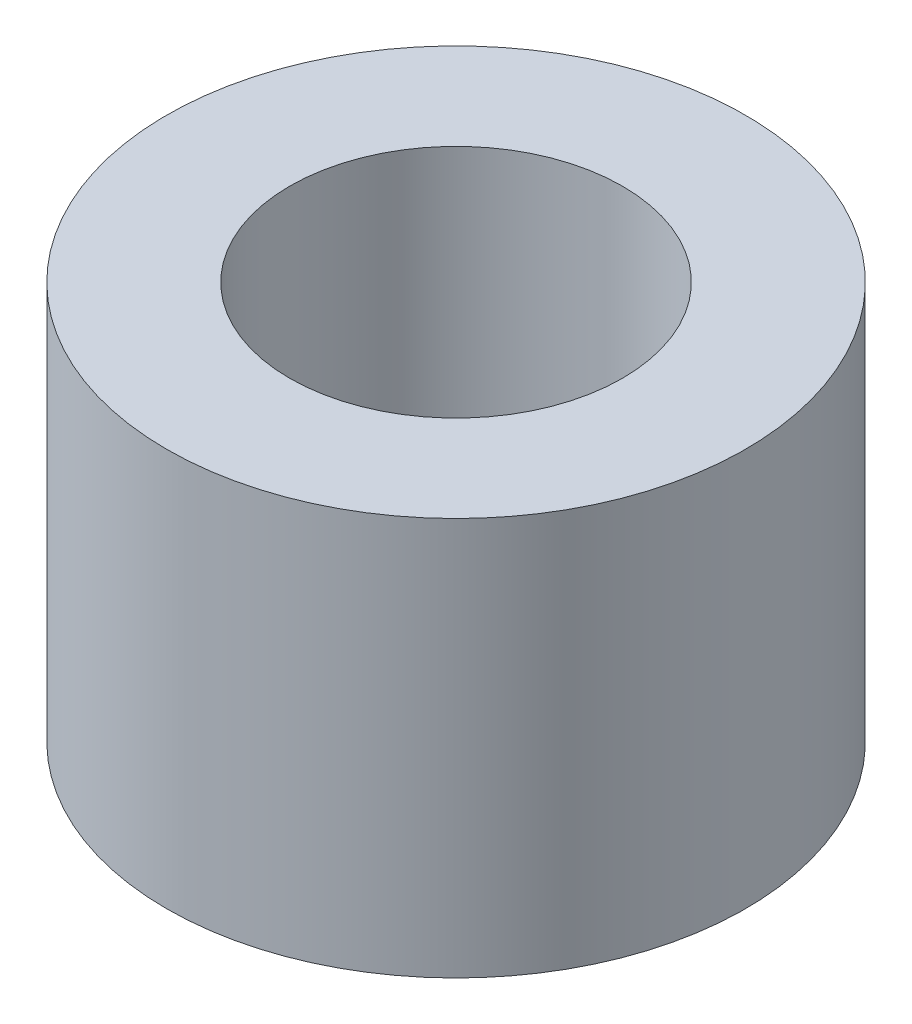
ISO-10303-21;
HEADER;
FILE_DESCRIPTION(('STEP AP214'),'2;1');
FILE_NAME('part.step','',(''),(''),'','','');
FILE_SCHEMA(('AUTOMOTIVE_DESIGN { 1 0 10303 214 1 1 1 1 }'));
ENDSEC;
DATA;
#1=APPLICATION_CONTEXT('core data for automotive mechanical design processes');
#2=APPLICATION_PROTOCOL_DEFINITION('international standard','automotive_design',2000,#1);
#3=PRODUCT_CONTEXT('',#1,'mechanical');
#4=PRODUCT('Part','Part','',(#3));
#5=PRODUCT_RELATED_PRODUCT_CATEGORY('part','',(#4));
#6=PRODUCT_DEFINITION_FORMATION('','',#4);
#7=PRODUCT_DEFINITION_CONTEXT('part definition',#1,'design');
#8=PRODUCT_DEFINITION('design','',#6,#7);
#9=PRODUCT_DEFINITION_SHAPE('','',#8);
#10=(LENGTH_UNIT() NAMED_UNIT(*) SI_UNIT(.MILLI.,.METRE.));
#11=(NAMED_UNIT(*) PLANE_ANGLE_UNIT() SI_UNIT($,.RADIAN.));
#12=(NAMED_UNIT(*) SI_UNIT($,.STERADIAN.) SOLID_ANGLE_UNIT());
#13=UNCERTAINTY_MEASURE_WITH_UNIT(LENGTH_MEASURE(1.E-05),#10,'distance_accuracy_value','');
#14=(GEOMETRIC_REPRESENTATION_CONTEXT(3) GLOBAL_UNCERTAINTY_ASSIGNED_CONTEXT((#13)) GLOBAL_UNIT_ASSIGNED_CONTEXT((#10,
#11,#12)) REPRESENTATION_CONTEXT('',''));
#15=CARTESIAN_POINT('',(0.,0.,0.));
#16=DIRECTION('',(0.,0.,1.));
#17=DIRECTION('',(1.,0.,0.));
#18=AXIS2_PLACEMENT_3D('',#15,#16,#17);
#19=CARTESIAN_POINT('',(-42.7097974549481,5.5,-13.2456721019878));
#20=DIRECTION('',(0.,1.,0.));
#21=DIRECTION('',(0.,0.,1.));
#22=AXIS2_PLACEMENT_3D('',#19,#20,#21);
#23=PLANE('',#22);
#24=CARTESIAN_POINT('',(-42.7097974549481,5.5,-13.2456721019878));
#25=DIRECTION('',(0.,1.,0.));
#26=DIRECTION('',(0.,0.,1.));
#27=AXIS2_PLACEMENT_3D('',#24,#25,#26);
#28=CIRCLE('',#27,4.);
#29=CARTESIAN_POINT('',(-42.7097974549481,5.5,-9.24567210198776));
#30=VERTEX_POINT('',#29);
#31=EDGE_CURVE('E10',#30,#30,#28,.T.);
#32=ORIENTED_EDGE('',*,*,#31,.T.);
#33=EDGE_LOOP('',(#32));
#34=FACE_BOUND('',#33,.T.);
#35=CARTESIAN_POINT('',(-42.7097974549481,5.5,-13.2456721019878));
#36=DIRECTION('',(0.,1.,0.));
#37=DIRECTION('',(0.,0.,1.));
#38=AXIS2_PLACEMENT_3D('',#35,#36,#37);
#39=CIRCLE('',#38,2.3);
#40=CARTESIAN_POINT('',(-42.7097974549481,5.5,-10.9456721019878));
#41=VERTEX_POINT('',#40);
#42=EDGE_CURVE('E50',#41,#41,#39,.T.);
#43=ORIENTED_EDGE('',*,*,#42,.F.);
#44=EDGE_LOOP('',(#43));
#45=FACE_BOUND('',#44,.T.);
#46=ADVANCED_FACE('F37',(#34,#45),#23,.T.);
#47=CARTESIAN_POINT('',(-42.7097974549481,0.,-13.2456721019878));
#48=DIRECTION('',(0.,1.,0.));
#49=DIRECTION('',(0.,0.,1.));
#50=AXIS2_PLACEMENT_3D('',#47,#48,#49);
#51=PLANE('',#50);
#52=CARTESIAN_POINT('',(-42.7097974549481,0.,-13.2456721019878));
#53=DIRECTION('',(0.,1.,0.));
#54=DIRECTION('',(0.,0.,1.));
#55=AXIS2_PLACEMENT_3D('',#52,#53,#54);
#56=CIRCLE('',#55,4.);
#57=CARTESIAN_POINT('',(-42.7097974549481,0.,-9.24567210198776));
#58=VERTEX_POINT('',#57);
#59=EDGE_CURVE('E41',#58,#58,#56,.T.);
#60=ORIENTED_EDGE('',*,*,#59,.F.);
#61=EDGE_LOOP('',(#60));
#62=FACE_BOUND('',#61,.T.);
#63=CARTESIAN_POINT('',(-42.7097974549481,0.,-13.2456721019878));
#64=DIRECTION('',(0.,1.,0.));
#65=DIRECTION('',(0.,0.,1.));
#66=AXIS2_PLACEMENT_3D('',#63,#64,#65);
#67=CIRCLE('',#66,2.3);
#68=CARTESIAN_POINT('',(-42.7097974549481,0.,-10.9456721019878));
#69=VERTEX_POINT('',#68);
#70=EDGE_CURVE('E52',#69,#69,#67,.T.);
#71=ORIENTED_EDGE('',*,*,#70,.T.);
#72=EDGE_LOOP('',(#71));
#73=FACE_BOUND('',#72,.T.);
#74=ADVANCED_FACE('F64',(#62,#73),#51,.F.);
#75=CARTESIAN_POINT('',(-42.7097974549481,5.5,-13.2456721019878));
#76=DIRECTION('',(0.,-1.,0.));
#77=DIRECTION('',(0.,0.,-1.));
#78=AXIS2_PLACEMENT_3D('',#75,#76,#77);
#79=CYLINDRICAL_SURFACE('',#78,4.);
#80=ORIENTED_EDGE('',*,*,#31,.F.);
#81=EDGE_LOOP('',(#80));
#82=FACE_BOUND('',#81,.T.);
#83=ORIENTED_EDGE('',*,*,#59,.T.);
#84=EDGE_LOOP('',(#83));
#85=FACE_BOUND('',#84,.T.);
#86=ADVANCED_FACE('F39',(#82,#85),#79,.T.);
#87=CARTESIAN_POINT('',(-42.7097974549481,5.5,-13.2456721019878));
#88=DIRECTION('',(0.,-1.,0.));
#89=DIRECTION('',(0.,0.,-1.));
#90=AXIS2_PLACEMENT_3D('',#87,#88,#89);
#91=CYLINDRICAL_SURFACE('',#90,2.3);
#92=ORIENTED_EDGE('',*,*,#42,.T.);
#93=EDGE_LOOP('',(#92));
#94=FACE_BOUND('',#93,.T.);
#95=ORIENTED_EDGE('',*,*,#70,.F.);
#96=EDGE_LOOP('',(#95));
#97=FACE_BOUND('',#96,.T.);
#98=ADVANCED_FACE('F60',(#94,#97),#91,.F.);
#99=CLOSED_SHELL('',(#46,#74,#86,#98));
#100=MANIFOLD_SOLID_BREP('B2',#99);
#101=ADVANCED_BREP_SHAPE_REPRESENTATION('',(#18,#100),#14);
#102=SHAPE_DEFINITION_REPRESENTATION(#9,#101);
ENDSEC;
END-ISO-10303-21;
